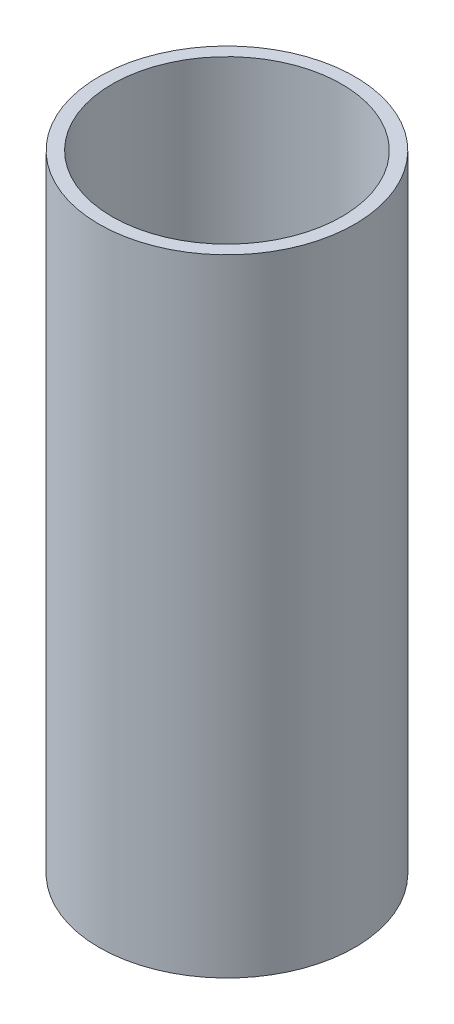
ISO-10303-21;
HEADER;
FILE_DESCRIPTION(('STEP AP214'),'2;1');
FILE_NAME('part.step','',(''),(''),'','','');
FILE_SCHEMA(('AUTOMOTIVE_DESIGN { 1 0 10303 214 1 1 1 1 }'));
ENDSEC;
DATA;
#1=APPLICATION_CONTEXT('core data for automotive mechanical design processes');
#2=APPLICATION_PROTOCOL_DEFINITION('international standard','automotive_design',2000,#1);
#3=PRODUCT_CONTEXT('',#1,'mechanical');
#4=PRODUCT('Part','Part','',(#3));
#5=PRODUCT_RELATED_PRODUCT_CATEGORY('part','',(#4));
#6=PRODUCT_DEFINITION_FORMATION('','',#4);
#7=PRODUCT_DEFINITION_CONTEXT('part definition',#1,'design');
#8=PRODUCT_DEFINITION('design','',#6,#7);
#9=PRODUCT_DEFINITION_SHAPE('','',#8);
#10=(LENGTH_UNIT() NAMED_UNIT(*) SI_UNIT(.MILLI.,.METRE.));
#11=(NAMED_UNIT(*) PLANE_ANGLE_UNIT() SI_UNIT($,.RADIAN.));
#12=(NAMED_UNIT(*) SI_UNIT($,.STERADIAN.) SOLID_ANGLE_UNIT());
#13=UNCERTAINTY_MEASURE_WITH_UNIT(LENGTH_MEASURE(1.E-05),#10,'distance_accuracy_value','');
#14=(GEOMETRIC_REPRESENTATION_CONTEXT(3) GLOBAL_UNCERTAINTY_ASSIGNED_CONTEXT((#13)) GLOBAL_UNIT_ASSIGNED_CONTEXT((#10,
#11,#12)) REPRESENTATION_CONTEXT('',''));
#15=CARTESIAN_POINT('',(0.,0.,0.));
#16=DIRECTION('',(0.,0.,1.));
#17=DIRECTION('',(1.,0.,0.));
#18=AXIS2_PLACEMENT_3D('',#15,#16,#17);
#19=CARTESIAN_POINT('',(0.,12.,0.));
#20=DIRECTION('',(0.,1.,0.));
#21=DIRECTION('',(0.,0.,1.));
#22=AXIS2_PLACEMENT_3D('',#19,#20,#21);
#23=PLANE('',#22);
#24=CARTESIAN_POINT('',(0.,12.,0.));
#25=DIRECTION('',(0.,1.,0.));
#26=DIRECTION('',(0.,0.,1.));
#27=AXIS2_PLACEMENT_3D('',#24,#25,#26);
#28=CIRCLE('',#27,4.9);
#29=CARTESIAN_POINT('',(0.,12.,4.9));
#30=VERTEX_POINT('',#29);
#31=EDGE_CURVE('E10',#30,#30,#28,.T.);
#32=ORIENTED_EDGE('',*,*,#31,.T.);
#33=EDGE_LOOP('',(#32));
#34=FACE_BOUND('',#33,.T.);
#35=CARTESIAN_POINT('',(0.,12.,0.));
#36=DIRECTION('',(0.,1.,0.));
#37=DIRECTION('',(0.,0.,1.));
#38=AXIS2_PLACEMENT_3D('',#35,#36,#37);
#39=CIRCLE('',#38,4.4);
#40=CARTESIAN_POINT('',(0.,12.,4.4));
#41=VERTEX_POINT('',#40);
#42=EDGE_CURVE('E42',#41,#41,#39,.T.);
#43=ORIENTED_EDGE('',*,*,#42,.F.);
#44=EDGE_LOOP('',(#43));
#45=FACE_BOUND('',#44,.T.);
#46=ADVANCED_FACE('F31',(#34,#45),#23,.T.);
#47=CARTESIAN_POINT('',(0.,-12.,0.));
#48=DIRECTION('',(0.,1.,0.));
#49=DIRECTION('',(0.,0.,1.));
#50=AXIS2_PLACEMENT_3D('',#47,#48,#49);
#51=PLANE('',#50);
#52=CARTESIAN_POINT('',(0.,-12.,0.));
#53=DIRECTION('',(0.,1.,0.));
#54=DIRECTION('',(0.,0.,1.));
#55=AXIS2_PLACEMENT_3D('',#52,#53,#54);
#56=CIRCLE('',#55,4.9);
#57=CARTESIAN_POINT('',(0.,-12.,4.9));
#58=VERTEX_POINT('',#57);
#59=EDGE_CURVE('E35',#58,#58,#56,.T.);
#60=ORIENTED_EDGE('',*,*,#59,.F.);
#61=EDGE_LOOP('',(#60));
#62=FACE_BOUND('',#61,.T.);
#63=CARTESIAN_POINT('',(0.,-12.,0.));
#64=DIRECTION('',(0.,1.,0.));
#65=DIRECTION('',(0.,0.,1.));
#66=AXIS2_PLACEMENT_3D('',#63,#64,#65);
#67=CIRCLE('',#66,4.4);
#68=CARTESIAN_POINT('',(0.,-12.,4.4));
#69=VERTEX_POINT('',#68);
#70=EDGE_CURVE('E44',#69,#69,#67,.T.);
#71=ORIENTED_EDGE('',*,*,#70,.T.);
#72=EDGE_LOOP('',(#71));
#73=FACE_BOUND('',#72,.T.);
#74=ADVANCED_FACE('F54',(#62,#73),#51,.F.);
#75=CARTESIAN_POINT('',(0.,12.,0.));
#76=DIRECTION('',(0.,-1.,0.));
#77=DIRECTION('',(0.,0.,-1.));
#78=AXIS2_PLACEMENT_3D('',#75,#76,#77);
#79=CYLINDRICAL_SURFACE('',#78,4.9);
#80=ORIENTED_EDGE('',*,*,#31,.F.);
#81=EDGE_LOOP('',(#80));
#82=FACE_BOUND('',#81,.T.);
#83=ORIENTED_EDGE('',*,*,#59,.T.);
#84=EDGE_LOOP('',(#83));
#85=FACE_BOUND('',#84,.T.);
#86=ADVANCED_FACE('F33',(#82,#85),#79,.T.);
#87=CARTESIAN_POINT('',(0.,12.,0.));
#88=DIRECTION('',(0.,-1.,0.));
#89=DIRECTION('',(0.,0.,-1.));
#90=AXIS2_PLACEMENT_3D('',#87,#88,#89);
#91=CYLINDRICAL_SURFACE('',#90,4.4);
#92=ORIENTED_EDGE('',*,*,#42,.T.);
#93=EDGE_LOOP('',(#92));
#94=FACE_BOUND('',#93,.T.);
#95=ORIENTED_EDGE('',*,*,#70,.F.);
#96=EDGE_LOOP('',(#95));
#97=FACE_BOUND('',#96,.T.);
#98=ADVANCED_FACE('F50',(#94,#97),#91,.F.);
#99=CLOSED_SHELL('',(#46,#74,#86,#98));
#100=MANIFOLD_SOLID_BREP('B2',#99);
#101=ADVANCED_BREP_SHAPE_REPRESENTATION('',(#18,#100),#14);
#102=SHAPE_DEFINITION_REPRESENTATION(#9,#101);
ENDSEC;
END-ISO-10303-21;
